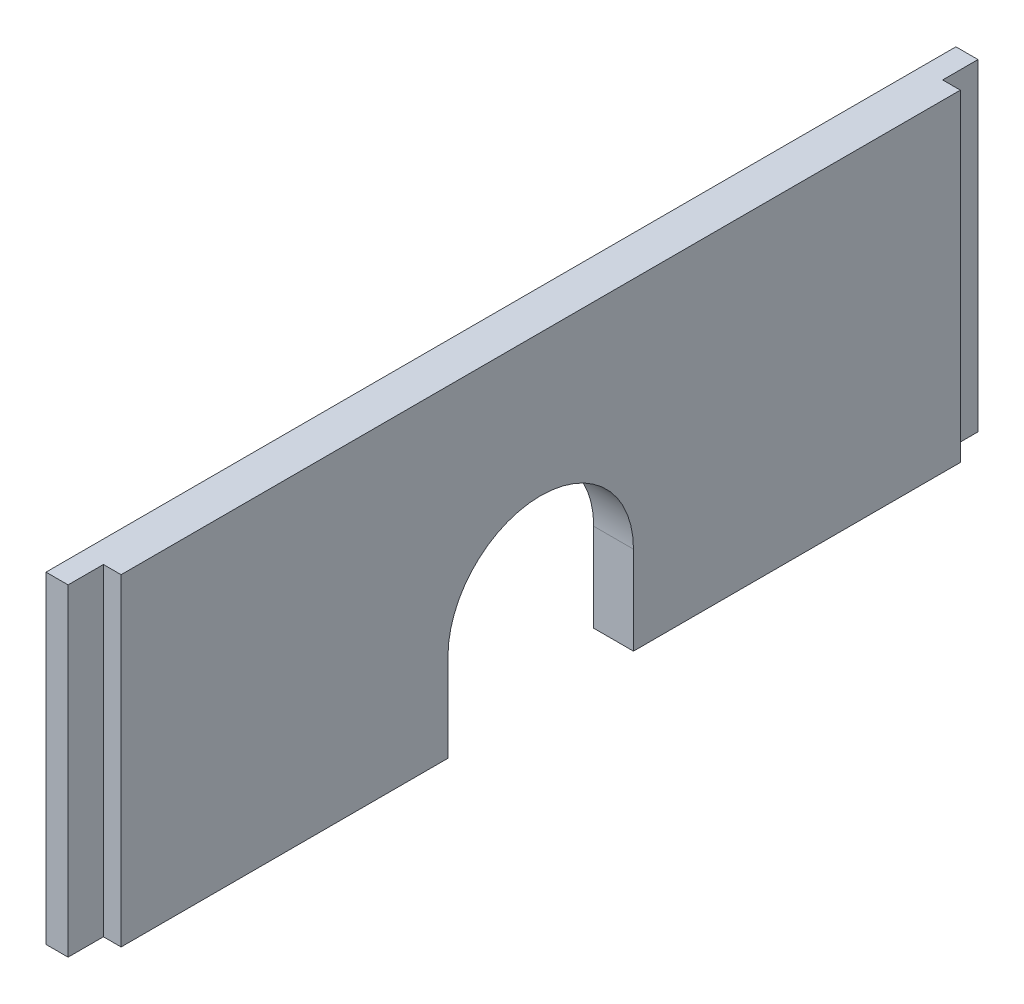
ISO-10303-21;
HEADER;
FILE_DESCRIPTION(('STEP AP214'),'2;1');
FILE_NAME('part.step','',(''),(''),'','','');
FILE_SCHEMA(('AUTOMOTIVE_DESIGN { 1 0 10303 214 1 1 1 1 }'));
ENDSEC;
DATA;
#1=APPLICATION_CONTEXT('core data for automotive mechanical design processes');
#2=APPLICATION_PROTOCOL_DEFINITION('international standard','automotive_design',2000,#1);
#3=PRODUCT_CONTEXT('',#1,'mechanical');
#4=PRODUCT('Part','Part','',(#3));
#5=PRODUCT_RELATED_PRODUCT_CATEGORY('part','',(#4));
#6=PRODUCT_DEFINITION_FORMATION('','',#4);
#7=PRODUCT_DEFINITION_CONTEXT('part definition',#1,'design');
#8=PRODUCT_DEFINITION('design','',#6,#7);
#9=PRODUCT_DEFINITION_SHAPE('','',#8);
#10=(LENGTH_UNIT() NAMED_UNIT(*) SI_UNIT(.MILLI.,.METRE.));
#11=(NAMED_UNIT(*) PLANE_ANGLE_UNIT() SI_UNIT($,.RADIAN.));
#12=(NAMED_UNIT(*) SI_UNIT($,.STERADIAN.) SOLID_ANGLE_UNIT());
#13=UNCERTAINTY_MEASURE_WITH_UNIT(LENGTH_MEASURE(1.E-05),#10,'distance_accuracy_value','');
#14=(GEOMETRIC_REPRESENTATION_CONTEXT(3) GLOBAL_UNCERTAINTY_ASSIGNED_CONTEXT((#13)) GLOBAL_UNIT_ASSIGNED_CONTEXT((#10,
#11,#12)) REPRESENTATION_CONTEXT('',''));
#15=CARTESIAN_POINT('',(0.,0.,0.));
#16=DIRECTION('',(0.,0.,1.));
#17=DIRECTION('',(1.,0.,0.));
#18=AXIS2_PLACEMENT_3D('',#15,#16,#17);
#19=CARTESIAN_POINT('',(2.5,99.5,0.));
#20=DIRECTION('',(1.,0.,0.));
#21=DIRECTION('',(0.,0.,-1.));
#22=AXIS2_PLACEMENT_3D('',#19,#20,#21);
#23=PLANE('',#22);
#24=DIRECTION('',(0.,-1.,0.));
#25=VECTOR('',#24,1.);
#26=CARTESIAN_POINT('',(2.5,99.5,0.));
#27=LINE('',#26,#25);
#28=CARTESIAN_POINT('',(2.5,36.5,0.));
#29=VERTEX_POINT('',#28);
#30=CARTESIAN_POINT('',(2.5,0.,0.));
#31=VERTEX_POINT('',#30);
#32=EDGE_CURVE('E11',#29,#31,#27,.T.);
#33=ORIENTED_EDGE('',*,*,#32,.F.);
#34=DIRECTION('',(0.,0.,-1.));
#35=VECTOR('',#34,1.);
#36=CARTESIAN_POINT('',(2.5,36.5,4.));
#37=LINE('',#36,#35);
#38=CARTESIAN_POINT('',(2.5,36.5,4.));
#39=VERTEX_POINT('',#38);
#40=EDGE_CURVE('E190',#39,#29,#37,.T.);
#41=ORIENTED_EDGE('',*,*,#40,.F.);
#42=DIRECTION('',(0.,-1.,0.));
#43=VECTOR('',#42,1.);
#44=CARTESIAN_POINT('',(2.5,99.5,4.));
#45=LINE('',#44,#43);
#46=CARTESIAN_POINT('',(2.5,0.,4.));
#47=VERTEX_POINT('',#46);
#48=EDGE_CURVE('E249',#39,#47,#45,.T.);
#49=ORIENTED_EDGE('',*,*,#48,.T.);
#50=DIRECTION('',(0.,0.,1.));
#51=VECTOR('',#50,1.);
#52=CARTESIAN_POINT('',(2.5,0.,0.));
#53=LINE('',#52,#51);
#54=EDGE_CURVE('E225',#31,#47,#53,.T.);
#55=ORIENTED_EDGE('',*,*,#54,.F.);
#56=EDGE_LOOP('',(#33,#41,#49,#55));
#57=FACE_BOUND('',#56,.T.);
#58=ADVANCED_FACE('F45',(#57),#23,.T.);
#59=CARTESIAN_POINT('',(0.,99.5,0.));
#60=DIRECTION('',(0.,0.,-1.));
#61=DIRECTION('',(-1.,0.,0.));
#62=AXIS2_PLACEMENT_3D('',#59,#60,#61);
#63=PLANE('',#62);
#64=DIRECTION('',(0.,-1.,0.));
#65=VECTOR('',#64,1.);
#66=CARTESIAN_POINT('',(0.,99.5,0.));
#67=LINE('',#66,#65);
#68=CARTESIAN_POINT('',(0.,36.5,0.));
#69=VERTEX_POINT('',#68);
#70=CARTESIAN_POINT('',(0.,0.,0.));
#71=VERTEX_POINT('',#70);
#72=EDGE_CURVE('E53',#69,#71,#67,.T.);
#73=ORIENTED_EDGE('',*,*,#72,.F.);
#74=DIRECTION('',(-1.,0.,0.));
#75=VECTOR('',#74,1.);
#76=CARTESIAN_POINT('',(2.5,36.5,0.));
#77=LINE('',#76,#75);
#78=EDGE_CURVE('E192',#29,#69,#77,.T.);
#79=ORIENTED_EDGE('',*,*,#78,.F.);
#80=ORIENTED_EDGE('',*,*,#32,.T.);
#81=DIRECTION('',(1.,0.,0.));
#82=VECTOR('',#81,1.);
#83=CARTESIAN_POINT('',(0.,0.,0.));
#84=LINE('',#83,#82);
#85=EDGE_CURVE('E228',#71,#31,#84,.T.);
#86=ORIENTED_EDGE('',*,*,#85,.F.);
#87=EDGE_LOOP('',(#73,#79,#80,#86));
#88=FACE_BOUND('',#87,.T.);
#89=ADVANCED_FACE('F47',(#88),#63,.T.);
#90=CARTESIAN_POINT('',(0.,99.5,0.));
#91=DIRECTION('',(1.,0.,0.));
#92=DIRECTION('',(0.,0.,-1.));
#93=AXIS2_PLACEMENT_3D('',#90,#91,#92);
#94=PLANE('',#93);
#95=DIRECTION('',(0.,0.,-1.));
#96=VECTOR('',#95,1.);
#97=CARTESIAN_POINT('',(0.,10.,82.5));
#98=LINE('',#97,#96);
#99=CARTESIAN_POINT('',(0.,10.,82.5));
#100=VERTEX_POINT('',#99);
#101=CARTESIAN_POINT('',(0.,10.,65.4999999999993));
#102=VERTEX_POINT('',#101);
#103=EDGE_CURVE('E164',#100,#102,#98,.T.);
#104=ORIENTED_EDGE('',*,*,#103,.F.);
#105=DIRECTION('',(0.,-1.,0.));
#106=VECTOR('',#105,1.);
#107=CARTESIAN_POINT('',(0.,10.,82.5));
#108=LINE('',#107,#106);
#109=CARTESIAN_POINT('',(0.,0.,82.5));
#110=VERTEX_POINT('',#109);
#111=EDGE_CURVE('E188',#100,#110,#108,.T.);
#112=ORIENTED_EDGE('',*,*,#111,.T.);
#113=DIRECTION('',(0.,0.,1.));
#114=VECTOR('',#113,1.);
#115=CARTESIAN_POINT('',(0.,0.,0.));
#116=LINE('',#115,#114);
#117=CARTESIAN_POINT('',(0.,0.,103.));
#118=VERTEX_POINT('',#117);
#119=EDGE_CURVE('E232',#110,#118,#116,.T.);
#120=ORIENTED_EDGE('',*,*,#119,.T.);
#121=DIRECTION('',(0.,-1.,0.));
#122=VECTOR('',#121,1.);
#123=CARTESIAN_POINT('',(0.,99.5,103.));
#124=LINE('',#123,#122);
#125=CARTESIAN_POINT('',(0.,36.5,103.));
#126=VERTEX_POINT('',#125);
#127=EDGE_CURVE('E259',#126,#118,#124,.T.);
#128=ORIENTED_EDGE('',*,*,#127,.F.);
#129=DIRECTION('',(0.,0.,1.));
#130=VECTOR('',#129,1.);
#131=CARTESIAN_POINT('',(0.,36.5,0.));
#132=LINE('',#131,#130);
#133=EDGE_CURVE('E194',#69,#126,#132,.T.);
#134=ORIENTED_EDGE('',*,*,#133,.F.);
#135=ORIENTED_EDGE('',*,*,#72,.T.);
#136=CARTESIAN_POINT('',(0.,0.,41.));
#137=VERTEX_POINT('',#136);
#138=EDGE_CURVE('E233',#71,#137,#116,.T.);
#139=ORIENTED_EDGE('',*,*,#138,.T.);
#140=DIRECTION('',(0.,-1.,0.));
#141=VECTOR('',#140,1.);
#142=CARTESIAN_POINT('',(0.,9.99999999999999,41.));
#143=LINE('',#142,#141);
#144=CARTESIAN_POINT('',(0.,9.99999999999999,41.));
#145=VERTEX_POINT('',#144);
#146=EDGE_CURVE('E203',#145,#137,#143,.T.);
#147=ORIENTED_EDGE('',*,*,#146,.F.);
#148=CARTESIAN_POINT('',(0.,9.99999999999999,51.5));
#149=DIRECTION('',(1.,0.,0.));
#150=DIRECTION('',(0.,0.,-1.));
#151=AXIS2_PLACEMENT_3D('',#148,#149,#150);
#152=CIRCLE('',#151,10.5);
#153=CARTESIAN_POINT('',(0.,9.99999999999999,62.));
#154=VERTEX_POINT('',#153);
#155=EDGE_CURVE('E205',#154,#145,#152,.F.);
#156=ORIENTED_EDGE('',*,*,#155,.F.);
#157=DIRECTION('',(0.,1.,0.));
#158=VECTOR('',#157,1.);
#159=CARTESIAN_POINT('',(0.,9.99999999999999,62.));
#160=LINE('',#159,#158);
#161=CARTESIAN_POINT('',(0.,0.,62.));
#162=VERTEX_POINT('',#161);
#163=EDGE_CURVE('E208',#162,#154,#160,.T.);
#164=ORIENTED_EDGE('',*,*,#163,.F.);
#165=CARTESIAN_POINT('',(0.,0.,65.4999999999993));
#166=VERTEX_POINT('',#165);
#167=EDGE_CURVE('E179',#162,#166,#116,.T.);
#168=ORIENTED_EDGE('',*,*,#167,.T.);
#169=DIRECTION('',(0.,-1.,0.));
#170=VECTOR('',#169,1.);
#171=CARTESIAN_POINT('',(0.,10.,65.4999999999993));
#172=LINE('',#171,#170);
#173=EDGE_CURVE('E60',#102,#166,#172,.T.);
#174=ORIENTED_EDGE('',*,*,#173,.F.);
#175=EDGE_LOOP('',(#104,#112,#120,#128,#134,#135,#139,#147,#156,#164,#168,#174));
#176=FACE_BOUND('',#175,.T.);
#177=ADVANCED_FACE('F176',(#176),#94,.F.);
#178=CARTESIAN_POINT('',(0.,99.5,103.));
#179=DIRECTION('',(0.,0.,-1.));
#180=DIRECTION('',(-1.,0.,0.));
#181=AXIS2_PLACEMENT_3D('',#178,#179,#180);
#182=PLANE('',#181);
#183=DIRECTION('',(1.,0.,0.));
#184=VECTOR('',#183,1.);
#185=CARTESIAN_POINT('',(0.,36.5,103.));
#186=LINE('',#185,#184);
#187=CARTESIAN_POINT('',(2.50000000000001,36.5,103.));
#188=VERTEX_POINT('',#187);
#189=EDGE_CURVE('E196',#126,#188,#186,.T.);
#190=ORIENTED_EDGE('',*,*,#189,.F.);
#191=ORIENTED_EDGE('',*,*,#127,.T.);
#192=DIRECTION('',(1.,0.,0.));
#193=VECTOR('',#192,1.);
#194=CARTESIAN_POINT('',(0.,0.,103.));
#195=LINE('',#194,#193);
#196=CARTESIAN_POINT('',(2.50000000000001,0.,103.));
#197=VERTEX_POINT('',#196);
#198=EDGE_CURVE('E236',#118,#197,#195,.T.);
#199=ORIENTED_EDGE('',*,*,#198,.T.);
#200=DIRECTION('',(0.,-1.,0.));
#201=VECTOR('',#200,1.);
#202=CARTESIAN_POINT('',(2.50000000000001,99.5,103.));
#203=LINE('',#202,#201);
#204=EDGE_CURVE('E257',#188,#197,#203,.T.);
#205=ORIENTED_EDGE('',*,*,#204,.F.);
#206=EDGE_LOOP('',(#190,#191,#199,#205));
#207=FACE_BOUND('',#206,.T.);
#208=ADVANCED_FACE('F316',(#207),#182,.F.);
#209=DIRECTION('',(0.,-1.,0.));
#210=VECTOR('',#209,1.);
#211=CARTESIAN_POINT('',(2.50000000000001,99.5,99.));
#212=LINE('',#211,#210);
#213=CARTESIAN_POINT('',(2.50000000000001,36.5,99.));
#214=VERTEX_POINT('',#213);
#215=CARTESIAN_POINT('',(2.50000000000001,0.,99.));
#216=VERTEX_POINT('',#215);
#217=EDGE_CURVE('E255',#214,#216,#212,.T.);
#218=ORIENTED_EDGE('',*,*,#217,.F.);
#219=DIRECTION('',(0.,0.,-1.));
#220=VECTOR('',#219,1.);
#221=CARTESIAN_POINT('',(2.50000000000001,36.5,103.));
#222=LINE('',#221,#220);
#223=EDGE_CURVE('E198',#188,#214,#222,.T.);
#224=ORIENTED_EDGE('',*,*,#223,.F.);
#225=ORIENTED_EDGE('',*,*,#204,.T.);
#226=EDGE_CURVE('E229',#216,#197,#53,.T.);
#227=ORIENTED_EDGE('',*,*,#226,.F.);
#228=EDGE_LOOP('',(#218,#224,#225,#227));
#229=FACE_BOUND('',#228,.T.);
#230=ADVANCED_FACE('F311',(#229),#23,.T.);
#231=CARTESIAN_POINT('',(0.,99.5,99.));
#232=DIRECTION('',(0.,0.,-1.));
#233=DIRECTION('',(-1.,0.,0.));
#234=AXIS2_PLACEMENT_3D('',#231,#232,#233);
#235=PLANE('',#234);
#236=DIRECTION('',(1.,0.,0.));
#237=VECTOR('',#236,1.);
#238=CARTESIAN_POINT('',(2.50000000000001,36.5,99.));
#239=LINE('',#238,#237);
#240=CARTESIAN_POINT('',(4.50000000000001,36.5,99.));
#241=VERTEX_POINT('',#240);
#242=EDGE_CURVE('E200',#214,#241,#239,.T.);
#243=ORIENTED_EDGE('',*,*,#242,.F.);
#244=ORIENTED_EDGE('',*,*,#217,.T.);
#245=DIRECTION('',(1.,0.,0.));
#246=VECTOR('',#245,1.);
#247=CARTESIAN_POINT('',(0.,0.,99.));
#248=LINE('',#247,#246);
#249=CARTESIAN_POINT('',(4.50000000000001,0.,99.));
#250=VERTEX_POINT('',#249);
#251=EDGE_CURVE('E239',#216,#250,#248,.T.);
#252=ORIENTED_EDGE('',*,*,#251,.T.);
#253=DIRECTION('',(0.,-1.,0.));
#254=VECTOR('',#253,1.);
#255=CARTESIAN_POINT('',(4.50000000000001,99.5,99.));
#256=LINE('',#255,#254);
#257=EDGE_CURVE('E253',#241,#250,#256,.T.);
#258=ORIENTED_EDGE('',*,*,#257,.F.);
#259=EDGE_LOOP('',(#243,#244,#252,#258));
#260=FACE_BOUND('',#259,.T.);
#261=ADVANCED_FACE('F305',(#260),#235,.F.);
#262=CARTESIAN_POINT('',(4.5,99.5,0.));
#263=DIRECTION('',(1.,0.,0.));
#264=DIRECTION('',(0.,0.,-1.));
#265=AXIS2_PLACEMENT_3D('',#262,#263,#264);
#266=PLANE('',#265);
#267=DIRECTION('',(0.,-1.,0.));
#268=VECTOR('',#267,1.);
#269=CARTESIAN_POINT('',(4.5,99.5,4.));
#270=LINE('',#269,#268);
#271=CARTESIAN_POINT('',(4.5,36.5,4.));
#272=VERTEX_POINT('',#271);
#273=CARTESIAN_POINT('',(4.5,0.,4.));
#274=VERTEX_POINT('',#273);
#275=EDGE_CURVE('E251',#272,#274,#270,.T.);
#276=ORIENTED_EDGE('',*,*,#275,.F.);
#277=DIRECTION('',(0.,0.,-1.));
#278=VECTOR('',#277,1.);
#279=CARTESIAN_POINT('',(4.50000000000001,36.5,99.));
#280=LINE('',#279,#278);
#281=EDGE_CURVE('E68',#241,#272,#280,.T.);
#282=ORIENTED_EDGE('',*,*,#281,.F.);
#283=ORIENTED_EDGE('',*,*,#257,.T.);
#284=DIRECTION('',(0.,0.,1.));
#285=VECTOR('',#284,1.);
#286=CARTESIAN_POINT('',(4.5,0.,0.));
#287=LINE('',#286,#285);
#288=CARTESIAN_POINT('',(4.50000000000001,0.,62.));
#289=VERTEX_POINT('',#288);
#290=EDGE_CURVE('E242',#289,#250,#287,.T.);
#291=ORIENTED_EDGE('',*,*,#290,.F.);
#292=DIRECTION('',(0.,-1.,0.));
#293=VECTOR('',#292,1.);
#294=CARTESIAN_POINT('',(4.50000000000001,9.99999999999999,62.));
#295=LINE('',#294,#293);
#296=CARTESIAN_POINT('',(4.50000000000001,9.99999999999999,62.));
#297=VERTEX_POINT('',#296);
#298=EDGE_CURVE('E211',#297,#289,#295,.T.);
#299=ORIENTED_EDGE('',*,*,#298,.F.);
#300=CARTESIAN_POINT('',(4.50000000000001,9.99999999999999,51.5));
#301=DIRECTION('',(1.,0.,0.));
#302=DIRECTION('',(0.,0.,-1.));
#303=AXIS2_PLACEMENT_3D('',#300,#301,#302);
#304=CIRCLE('',#303,10.5);
#305=CARTESIAN_POINT('',(4.5,9.99999999999999,41.));
#306=VERTEX_POINT('',#305);
#307=EDGE_CURVE('E202',#306,#297,#304,.T.);
#308=ORIENTED_EDGE('',*,*,#307,.F.);
#309=DIRECTION('',(0.,1.,0.));
#310=VECTOR('',#309,1.);
#311=CARTESIAN_POINT('',(4.5,9.99999999999999,41.));
#312=LINE('',#311,#310);
#313=CARTESIAN_POINT('',(4.5,0.,41.));
#314=VERTEX_POINT('',#313);
#315=EDGE_CURVE('E213',#314,#306,#312,.T.);
#316=ORIENTED_EDGE('',*,*,#315,.F.);
#317=EDGE_CURVE('E243',#274,#314,#287,.T.);
#318=ORIENTED_EDGE('',*,*,#317,.F.);
#319=EDGE_LOOP('',(#276,#282,#283,#291,#299,#308,#316,#318));
#320=FACE_BOUND('',#319,.T.);
#321=ADVANCED_FACE('F284',(#320),#266,.T.);
#322=CARTESIAN_POINT('',(0.,99.5,4.));
#323=DIRECTION('',(0.,0.,-1.));
#324=DIRECTION('',(-1.,0.,0.));
#325=AXIS2_PLACEMENT_3D('',#322,#323,#324);
#326=PLANE('',#325);
#327=ORIENTED_EDGE('',*,*,#48,.F.);
#328=DIRECTION('',(-1.,0.,0.));
#329=VECTOR('',#328,1.);
#330=CARTESIAN_POINT('',(4.5,36.5,4.));
#331=LINE('',#330,#329);
#332=EDGE_CURVE('E187',#272,#39,#331,.T.);
#333=ORIENTED_EDGE('',*,*,#332,.F.);
#334=ORIENTED_EDGE('',*,*,#275,.T.);
#335=DIRECTION('',(1.,0.,0.));
#336=VECTOR('',#335,1.);
#337=CARTESIAN_POINT('',(0.,0.,4.));
#338=LINE('',#337,#336);
#339=EDGE_CURVE('E246',#47,#274,#338,.T.);
#340=ORIENTED_EDGE('',*,*,#339,.F.);
#341=EDGE_LOOP('',(#327,#333,#334,#340));
#342=FACE_BOUND('',#341,.T.);
#343=ADVANCED_FACE('F279',(#342),#326,.T.);
#344=CARTESIAN_POINT('',(0.,0.,0.));
#345=DIRECTION('',(0.,1.,0.));
#346=DIRECTION('',(0.,0.,1.));
#347=AXIS2_PLACEMENT_3D('',#344,#345,#346);
#348=PLANE('',#347);
#349=ORIENTED_EDGE('',*,*,#317,.T.);
#350=DIRECTION('',(1.,0.,0.));
#351=VECTOR('',#350,1.);
#352=CARTESIAN_POINT('',(-29.3470611816584,0.,41.));
#353=LINE('',#352,#351);
#354=EDGE_CURVE('E218',#137,#314,#353,.T.);
#355=ORIENTED_EDGE('',*,*,#354,.F.);
#356=ORIENTED_EDGE('',*,*,#138,.F.);
#357=ORIENTED_EDGE('',*,*,#85,.T.);
#358=ORIENTED_EDGE('',*,*,#54,.T.);
#359=ORIENTED_EDGE('',*,*,#339,.T.);
#360=EDGE_LOOP('',(#349,#355,#356,#357,#358,#359));
#361=FACE_BOUND('',#360,.T.);
#362=ADVANCED_FACE('F271',(#361),#348,.F.);
#363=ORIENTED_EDGE('',*,*,#119,.F.);
#364=DIRECTION('',(-1.,0.,0.));
#365=VECTOR('',#364,1.);
#366=CARTESIAN_POINT('',(0.,0.,82.5));
#367=LINE('',#366,#365);
#368=CARTESIAN_POINT('',(1.6000000000003,0.,82.5));
#369=VERTEX_POINT('',#368);
#370=EDGE_CURVE('E173',#369,#110,#367,.T.);
#371=ORIENTED_EDGE('',*,*,#370,.F.);
#372=DIRECTION('',(0.,0.,1.));
#373=VECTOR('',#372,1.);
#374=CARTESIAN_POINT('',(1.6000000000003,0.,82.5));
#375=LINE('',#374,#373);
#376=CARTESIAN_POINT('',(1.6000000000003,0.,65.4999999999993));
#377=VERTEX_POINT('',#376);
#378=EDGE_CURVE('E323',#377,#369,#375,.T.);
#379=ORIENTED_EDGE('',*,*,#378,.F.);
#380=DIRECTION('',(1.,0.,0.));
#381=VECTOR('',#380,1.);
#382=CARTESIAN_POINT('',(0.,0.,65.4999999999993));
#383=LINE('',#382,#381);
#384=EDGE_CURVE('E326',#166,#377,#383,.T.);
#385=ORIENTED_EDGE('',*,*,#384,.F.);
#386=ORIENTED_EDGE('',*,*,#167,.F.);
#387=DIRECTION('',(1.,0.,0.));
#388=VECTOR('',#387,1.);
#389=CARTESIAN_POINT('',(-29.3470611816584,0.,62.));
#390=LINE('',#389,#388);
#391=EDGE_CURVE('E220',#162,#289,#390,.T.);
#392=ORIENTED_EDGE('',*,*,#391,.T.);
#393=ORIENTED_EDGE('',*,*,#290,.T.);
#394=ORIENTED_EDGE('',*,*,#251,.F.);
#395=ORIENTED_EDGE('',*,*,#226,.T.);
#396=ORIENTED_EDGE('',*,*,#198,.F.);
#397=EDGE_LOOP('',(#363,#371,#379,#385,#386,#392,#393,#394,#395,#396));
#398=FACE_BOUND('',#397,.T.);
#399=ADVANCED_FACE('F300',(#398),#348,.F.);
#400=CARTESIAN_POINT('',(-29.3470611816584,9.99999999999999,51.5));
#401=DIRECTION('',(1.,0.,0.));
#402=DIRECTION('',(0.,0.,-1.));
#403=AXIS2_PLACEMENT_3D('',#400,#401,#402);
#404=CYLINDRICAL_SURFACE('',#403,10.5);
#405=ORIENTED_EDGE('',*,*,#155,.T.);
#406=DIRECTION('',(1.,0.,0.));
#407=VECTOR('',#406,1.);
#408=CARTESIAN_POINT('',(-29.3470611816584,9.99999999999999,41.));
#409=LINE('',#408,#407);
#410=EDGE_CURVE('E206',#145,#306,#409,.T.);
#411=ORIENTED_EDGE('',*,*,#410,.T.);
#412=ORIENTED_EDGE('',*,*,#307,.T.);
#413=DIRECTION('',(1.,0.,0.));
#414=VECTOR('',#413,1.);
#415=CARTESIAN_POINT('',(-29.3470611816584,9.99999999999999,62.));
#416=LINE('',#415,#414);
#417=EDGE_CURVE('E216',#154,#297,#416,.T.);
#418=ORIENTED_EDGE('',*,*,#417,.F.);
#419=EDGE_LOOP('',(#405,#411,#412,#418));
#420=FACE_BOUND('',#419,.T.);
#421=ADVANCED_FACE('F293',(#420),#404,.F.);
#422=CARTESIAN_POINT('',(-29.3470611816584,9.99999999999999,41.));
#423=DIRECTION('',(0.,0.,-1.));
#424=DIRECTION('',(-1.,0.,0.));
#425=AXIS2_PLACEMENT_3D('',#422,#423,#424);
#426=PLANE('',#425);
#427=ORIENTED_EDGE('',*,*,#146,.T.);
#428=ORIENTED_EDGE('',*,*,#354,.T.);
#429=ORIENTED_EDGE('',*,*,#315,.T.);
#430=ORIENTED_EDGE('',*,*,#410,.F.);
#431=EDGE_LOOP('',(#427,#428,#429,#430));
#432=FACE_BOUND('',#431,.T.);
#433=ADVANCED_FACE('F289',(#432),#426,.F.);
#434=CARTESIAN_POINT('',(-29.3470611816584,9.99999999999999,62.));
#435=DIRECTION('',(0.,0.,1.));
#436=DIRECTION('',(1.,0.,0.));
#437=AXIS2_PLACEMENT_3D('',#434,#435,#436);
#438=PLANE('',#437);
#439=ORIENTED_EDGE('',*,*,#163,.T.);
#440=ORIENTED_EDGE('',*,*,#417,.T.);
#441=ORIENTED_EDGE('',*,*,#298,.T.);
#442=ORIENTED_EDGE('',*,*,#391,.F.);
#443=EDGE_LOOP('',(#439,#440,#441,#442));
#444=FACE_BOUND('',#443,.T.);
#445=ADVANCED_FACE('F295',(#444),#438,.F.);
#446=CARTESIAN_POINT('',(0.,36.5,0.));
#447=DIRECTION('',(0.,1.,0.));
#448=DIRECTION('',(0.,0.,1.));
#449=AXIS2_PLACEMENT_3D('',#446,#447,#448);
#450=PLANE('',#449);
#451=ORIENTED_EDGE('',*,*,#281,.T.);
#452=ORIENTED_EDGE('',*,*,#332,.T.);
#453=ORIENTED_EDGE('',*,*,#40,.T.);
#454=ORIENTED_EDGE('',*,*,#78,.T.);
#455=ORIENTED_EDGE('',*,*,#133,.T.);
#456=ORIENTED_EDGE('',*,*,#189,.T.);
#457=ORIENTED_EDGE('',*,*,#223,.T.);
#458=ORIENTED_EDGE('',*,*,#242,.T.);
#459=EDGE_LOOP('',(#451,#452,#453,#454,#455,#456,#457,#458));
#460=FACE_BOUND('',#459,.T.);
#461=ADVANCED_FACE('F338',(#460),#450,.T.);
#462=CARTESIAN_POINT('',(0.,10.,82.5));
#463=DIRECTION('',(0.,0.,1.));
#464=DIRECTION('',(1.,0.,0.));
#465=AXIS2_PLACEMENT_3D('',#462,#463,#464);
#466=PLANE('',#465);
#467=ORIENTED_EDGE('',*,*,#370,.T.);
#468=ORIENTED_EDGE('',*,*,#111,.F.);
#469=DIRECTION('',(-1.,0.,0.));
#470=VECTOR('',#469,1.);
#471=CARTESIAN_POINT('',(0.,10.,82.5));
#472=LINE('',#471,#470);
#473=CARTESIAN_POINT('',(1.6000000000003,10.,82.5));
#474=VERTEX_POINT('',#473);
#475=EDGE_CURVE('E170',#474,#100,#472,.T.);
#476=ORIENTED_EDGE('',*,*,#475,.F.);
#477=DIRECTION('',(0.,-1.,0.));
#478=VECTOR('',#477,1.);
#479=CARTESIAN_POINT('',(1.6000000000003,10.,82.5));
#480=LINE('',#479,#478);
#481=EDGE_CURVE('E181',#474,#369,#480,.T.);
#482=ORIENTED_EDGE('',*,*,#481,.T.);
#483=EDGE_LOOP('',(#467,#468,#476,#482));
#484=FACE_BOUND('',#483,.T.);
#485=ADVANCED_FACE('F329',(#484),#466,.F.);
#486=CARTESIAN_POINT('',(1.6000000000003,10.,82.5));
#487=DIRECTION('',(1.,0.,0.));
#488=DIRECTION('',(0.,0.,-1.));
#489=AXIS2_PLACEMENT_3D('',#486,#487,#488);
#490=PLANE('',#489);
#491=ORIENTED_EDGE('',*,*,#378,.T.);
#492=ORIENTED_EDGE('',*,*,#481,.F.);
#493=DIRECTION('',(0.,0.,1.));
#494=VECTOR('',#493,1.);
#495=CARTESIAN_POINT('',(1.6000000000003,10.,82.5));
#496=LINE('',#495,#494);
#497=CARTESIAN_POINT('',(1.6000000000003,10.,65.4999999999993));
#498=VERTEX_POINT('',#497);
#499=EDGE_CURVE('E163',#498,#474,#496,.T.);
#500=ORIENTED_EDGE('',*,*,#499,.F.);
#501=DIRECTION('',(0.,-1.,0.));
#502=VECTOR('',#501,1.);
#503=CARTESIAN_POINT('',(1.6000000000003,10.,65.4999999999993));
#504=LINE('',#503,#502);
#505=EDGE_CURVE('E159',#498,#377,#504,.T.);
#506=ORIENTED_EDGE('',*,*,#505,.T.);
#507=EDGE_LOOP('',(#491,#492,#500,#506));
#508=FACE_BOUND('',#507,.T.);
#509=ADVANCED_FACE('F330',(#508),#490,.F.);
#510=CARTESIAN_POINT('',(0.,10.,65.4999999999993));
#511=DIRECTION('',(0.,0.,-1.));
#512=DIRECTION('',(-1.,0.,0.));
#513=AXIS2_PLACEMENT_3D('',#510,#511,#512);
#514=PLANE('',#513);
#515=ORIENTED_EDGE('',*,*,#384,.T.);
#516=ORIENTED_EDGE('',*,*,#505,.F.);
#517=DIRECTION('',(1.,0.,0.));
#518=VECTOR('',#517,1.);
#519=CARTESIAN_POINT('',(0.,10.,65.4999999999993));
#520=LINE('',#519,#518);
#521=EDGE_CURVE('E156',#102,#498,#520,.T.);
#522=ORIENTED_EDGE('',*,*,#521,.F.);
#523=ORIENTED_EDGE('',*,*,#173,.T.);
#524=EDGE_LOOP('',(#515,#516,#522,#523));
#525=FACE_BOUND('',#524,.T.);
#526=ADVANCED_FACE('F158',(#525),#514,.F.);
#527=CARTESIAN_POINT('',(0.,10.,0.));
#528=DIRECTION('',(0.,-1.,0.));
#529=DIRECTION('',(0.,0.,-1.));
#530=AXIS2_PLACEMENT_3D('',#527,#528,#529);
#531=PLANE('',#530);
#532=ORIENTED_EDGE('',*,*,#103,.T.);
#533=ORIENTED_EDGE('',*,*,#521,.T.);
#534=ORIENTED_EDGE('',*,*,#499,.T.);
#535=ORIENTED_EDGE('',*,*,#475,.T.);
#536=EDGE_LOOP('',(#532,#533,#534,#535));
#537=FACE_BOUND('',#536,.T.);
#538=ADVANCED_FACE('F168',(#537),#531,.T.);
#539=CLOSED_SHELL('',(#58,#89,#177,#208,#230,#261,#321,#343,#362,#399,#421,#433,#445,#461,#485,
#509,#526,#538));
#540=MANIFOLD_SOLID_BREP('B2',#539);
#541=ADVANCED_BREP_SHAPE_REPRESENTATION('',(#18,#540),#14);
#542=SHAPE_DEFINITION_REPRESENTATION(#9,#541);
ENDSEC;
END-ISO-10303-21;
